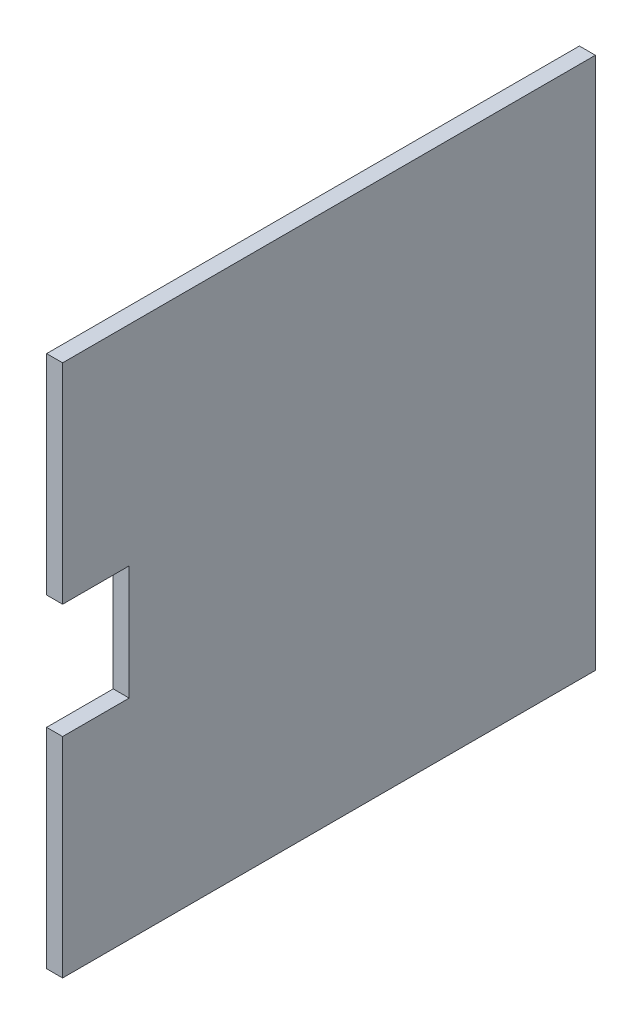
ISO-10303-21;
HEADER;
FILE_DESCRIPTION(('STEP AP214'),'2;1');
FILE_NAME('part.step','',(''),(''),'','','');
FILE_SCHEMA(('AUTOMOTIVE_DESIGN { 1 0 10303 214 1 1 1 1 }'));
ENDSEC;
DATA;
#1=APPLICATION_CONTEXT('core data for automotive mechanical design processes');
#2=APPLICATION_PROTOCOL_DEFINITION('international standard','automotive_design',2000,#1);
#3=PRODUCT_CONTEXT('',#1,'mechanical');
#4=PRODUCT('Part','Part','',(#3));
#5=PRODUCT_RELATED_PRODUCT_CATEGORY('part','',(#4));
#6=PRODUCT_DEFINITION_FORMATION('','',#4);
#7=PRODUCT_DEFINITION_CONTEXT('part definition',#1,'design');
#8=PRODUCT_DEFINITION('design','',#6,#7);
#9=PRODUCT_DEFINITION_SHAPE('','',#8);
#10=(LENGTH_UNIT() NAMED_UNIT(*) SI_UNIT(.MILLI.,.METRE.));
#11=(NAMED_UNIT(*) PLANE_ANGLE_UNIT() SI_UNIT($,.RADIAN.));
#12=(NAMED_UNIT(*) SI_UNIT($,.STERADIAN.) SOLID_ANGLE_UNIT());
#13=UNCERTAINTY_MEASURE_WITH_UNIT(LENGTH_MEASURE(1.E-05),#10,'distance_accuracy_value','');
#14=(GEOMETRIC_REPRESENTATION_CONTEXT(3) GLOBAL_UNCERTAINTY_ASSIGNED_CONTEXT((#13)) GLOBAL_UNIT_ASSIGNED_CONTEXT((#10,
#11,#12)) REPRESENTATION_CONTEXT('',''));
#15=CARTESIAN_POINT('',(0.,0.,0.));
#16=DIRECTION('',(0.,0.,1.));
#17=DIRECTION('',(1.,0.,0.));
#18=AXIS2_PLACEMENT_3D('',#15,#16,#17);
#19=CARTESIAN_POINT('',(6.,83.9093072496867,81.030303030303));
#20=DIRECTION('',(0.,0.,-1.));
#21=DIRECTION('',(-1.,0.,0.));
#22=AXIS2_PLACEMENT_3D('',#19,#20,#21);
#23=PLANE('',#22);
#24=DIRECTION('',(0.,-1.,0.));
#25=VECTOR('',#24,1.);
#26=CARTESIAN_POINT('',(0.,83.9093072496867,81.030303030303));
#27=LINE('',#26,#25);
#28=CARTESIAN_POINT('',(0.,83.9093072496867,81.030303030303));
#29=VERTEX_POINT('',#28);
#30=CARTESIAN_POINT('',(0.,5.40930724968666,81.030303030303));
#31=VERTEX_POINT('',#30);
#32=EDGE_CURVE('E140',#29,#31,#27,.T.);
#33=ORIENTED_EDGE('',*,*,#32,.T.);
#34=DIRECTION('',(-1.,0.,0.));
#35=VECTOR('',#34,1.);
#36=CARTESIAN_POINT('',(6.,5.40930724968666,81.030303030303));
#37=LINE('',#36,#35);
#38=CARTESIAN_POINT('',(6.,5.40930724968666,81.030303030303));
#39=VERTEX_POINT('',#38);
#40=EDGE_CURVE('E11',#39,#31,#37,.T.);
#41=ORIENTED_EDGE('',*,*,#40,.F.);
#42=DIRECTION('',(0.,-1.,0.));
#43=VECTOR('',#42,1.);
#44=CARTESIAN_POINT('',(6.,83.9093072496867,81.030303030303));
#45=LINE('',#44,#43);
#46=CARTESIAN_POINT('',(6.,83.9093072496867,81.030303030303));
#47=VERTEX_POINT('',#46);
#48=EDGE_CURVE('E163',#47,#39,#45,.T.);
#49=ORIENTED_EDGE('',*,*,#48,.F.);
#50=DIRECTION('',(-1.,0.,0.));
#51=VECTOR('',#50,1.);
#52=CARTESIAN_POINT('',(6.,83.9093072496867,81.030303030303));
#53=LINE('',#52,#51);
#54=EDGE_CURVE('E136',#47,#29,#53,.T.);
#55=ORIENTED_EDGE('',*,*,#54,.T.);
#56=EDGE_LOOP('',(#33,#41,#49,#55));
#57=FACE_BOUND('',#56,.T.);
#58=ADVANCED_FACE('F39',(#57),#23,.F.);
#59=CARTESIAN_POINT('',(6.,5.40930724968666,81.030303030303));
#60=DIRECTION('',(0.,1.,0.));
#61=DIRECTION('',(0.,0.,1.));
#62=AXIS2_PLACEMENT_3D('',#59,#60,#61);
#63=PLANE('',#62);
#64=DIRECTION('',(0.,0.,-1.));
#65=VECTOR('',#64,1.);
#66=CARTESIAN_POINT('',(0.,5.40930724968666,81.030303030303));
#67=LINE('',#66,#65);
#68=CARTESIAN_POINT('',(0.,5.40930724968666,56.030303030303));
#69=VERTEX_POINT('',#68);
#70=EDGE_CURVE('E144',#31,#69,#67,.T.);
#71=ORIENTED_EDGE('',*,*,#70,.T.);
#72=DIRECTION('',(-1.,0.,0.));
#73=VECTOR('',#72,1.);
#74=CARTESIAN_POINT('',(6.,5.40930724968666,56.030303030303));
#75=LINE('',#74,#73);
#76=CARTESIAN_POINT('',(6.,5.40930724968666,56.030303030303));
#77=VERTEX_POINT('',#76);
#78=EDGE_CURVE('E48',#77,#69,#75,.T.);
#79=ORIENTED_EDGE('',*,*,#78,.F.);
#80=DIRECTION('',(0.,0.,-1.));
#81=VECTOR('',#80,1.);
#82=CARTESIAN_POINT('',(6.,5.40930724968666,81.030303030303));
#83=LINE('',#82,#81);
#84=EDGE_CURVE('E99',#39,#77,#83,.T.);
#85=ORIENTED_EDGE('',*,*,#84,.F.);
#86=ORIENTED_EDGE('',*,*,#40,.T.);
#87=EDGE_LOOP('',(#71,#79,#85,#86));
#88=FACE_BOUND('',#87,.T.);
#89=ADVANCED_FACE('F184',(#88),#63,.F.);
#90=CARTESIAN_POINT('',(6.,-16.0906927503133,56.030303030303));
#91=DIRECTION('',(0.,0.,-1.));
#92=DIRECTION('',(-1.,0.,0.));
#93=AXIS2_PLACEMENT_3D('',#90,#91,#92);
#94=PLANE('',#93);
#95=DIRECTION('',(0.,-1.,0.));
#96=VECTOR('',#95,1.);
#97=CARTESIAN_POINT('',(0.,-16.0906927503133,56.030303030303));
#98=LINE('',#97,#96);
#99=CARTESIAN_POINT('',(0.,-37.5906927503133,56.030303030303));
#100=VERTEX_POINT('',#99);
#101=EDGE_CURVE('E148',#69,#100,#98,.T.);
#102=ORIENTED_EDGE('',*,*,#101,.T.);
#103=DIRECTION('',(-1.,0.,0.));
#104=VECTOR('',#103,1.);
#105=CARTESIAN_POINT('',(6.,-37.5906927503133,56.030303030303));
#106=LINE('',#105,#104);
#107=CARTESIAN_POINT('',(6.,-37.5906927503133,56.030303030303));
#108=VERTEX_POINT('',#107);
#109=EDGE_CURVE('E174',#108,#100,#106,.T.);
#110=ORIENTED_EDGE('',*,*,#109,.F.);
#111=DIRECTION('',(0.,-1.,0.));
#112=VECTOR('',#111,1.);
#113=CARTESIAN_POINT('',(6.,-16.0906927503133,56.030303030303));
#114=LINE('',#113,#112);
#115=EDGE_CURVE('E183',#77,#108,#114,.T.);
#116=ORIENTED_EDGE('',*,*,#115,.F.);
#117=ORIENTED_EDGE('',*,*,#78,.T.);
#118=EDGE_LOOP('',(#102,#110,#116,#117));
#119=FACE_BOUND('',#118,.T.);
#120=ADVANCED_FACE('F181',(#119),#94,.F.);
#121=CARTESIAN_POINT('',(6.,-37.5906927503133,81.030303030303));
#122=DIRECTION('',(0.,-1.,0.));
#123=DIRECTION('',(0.,0.,-1.));
#124=AXIS2_PLACEMENT_3D('',#121,#122,#123);
#125=PLANE('',#124);
#126=DIRECTION('',(0.,0.,1.));
#127=VECTOR('',#126,1.);
#128=CARTESIAN_POINT('',(0.,-37.5906927503133,81.030303030303));
#129=LINE('',#128,#127);
#130=CARTESIAN_POINT('',(0.,-37.5906927503133,81.030303030303));
#131=VERTEX_POINT('',#130);
#132=EDGE_CURVE('E151',#100,#131,#129,.T.);
#133=ORIENTED_EDGE('',*,*,#132,.T.);
#134=DIRECTION('',(-1.,0.,0.));
#135=VECTOR('',#134,1.);
#136=CARTESIAN_POINT('',(6.,-37.5906927503133,81.030303030303));
#137=LINE('',#136,#135);
#138=CARTESIAN_POINT('',(6.,-37.5906927503133,81.030303030303));
#139=VERTEX_POINT('',#138);
#140=EDGE_CURVE('E170',#139,#131,#137,.T.);
#141=ORIENTED_EDGE('',*,*,#140,.F.);
#142=DIRECTION('',(0.,0.,1.));
#143=VECTOR('',#142,1.);
#144=CARTESIAN_POINT('',(6.,-37.5906927503133,81.030303030303));
#145=LINE('',#144,#143);
#146=EDGE_CURVE('E198',#108,#139,#145,.T.);
#147=ORIENTED_EDGE('',*,*,#146,.F.);
#148=ORIENTED_EDGE('',*,*,#109,.T.);
#149=EDGE_LOOP('',(#133,#141,#147,#148));
#150=FACE_BOUND('',#149,.T.);
#151=ADVANCED_FACE('F193',(#150),#125,.F.);
#152=CARTESIAN_POINT('',(6.,-37.5906927503133,81.030303030303));
#153=DIRECTION('',(0.,0.,-1.));
#154=DIRECTION('',(-1.,0.,0.));
#155=AXIS2_PLACEMENT_3D('',#152,#153,#154);
#156=PLANE('',#155);
#157=DIRECTION('',(0.,-1.,0.));
#158=VECTOR('',#157,1.);
#159=CARTESIAN_POINT('',(0.,-37.5906927503133,81.030303030303));
#160=LINE('',#159,#158);
#161=CARTESIAN_POINT('',(0.,-116.090692750313,81.030303030303));
#162=VERTEX_POINT('',#161);
#163=EDGE_CURVE('E154',#131,#162,#160,.T.);
#164=ORIENTED_EDGE('',*,*,#163,.T.);
#165=DIRECTION('',(-1.,0.,0.));
#166=VECTOR('',#165,1.);
#167=CARTESIAN_POINT('',(6.,-116.090692750313,81.030303030303));
#168=LINE('',#167,#166);
#169=CARTESIAN_POINT('',(6.,-116.090692750313,81.030303030303));
#170=VERTEX_POINT('',#169);
#171=EDGE_CURVE('E129',#170,#162,#168,.T.);
#172=ORIENTED_EDGE('',*,*,#171,.F.);
#173=DIRECTION('',(0.,-1.,0.));
#174=VECTOR('',#173,1.);
#175=CARTESIAN_POINT('',(6.,-37.5906927503133,81.030303030303));
#176=LINE('',#175,#174);
#177=EDGE_CURVE('E118',#139,#170,#176,.T.);
#178=ORIENTED_EDGE('',*,*,#177,.F.);
#179=ORIENTED_EDGE('',*,*,#140,.T.);
#180=EDGE_LOOP('',(#164,#172,#178,#179));
#181=FACE_BOUND('',#180,.T.);
#182=ADVANCED_FACE('F196',(#181),#156,.F.);
#183=CARTESIAN_POINT('',(6.,-116.090692750313,81.030303030303));
#184=DIRECTION('',(0.,1.,0.));
#185=DIRECTION('',(0.,0.,1.));
#186=AXIS2_PLACEMENT_3D('',#183,#184,#185);
#187=PLANE('',#186);
#188=DIRECTION('',(0.,0.,-1.));
#189=VECTOR('',#188,1.);
#190=CARTESIAN_POINT('',(0.,-116.090692750313,81.030303030303));
#191=LINE('',#190,#189);
#192=CARTESIAN_POINT('',(0.,-116.090692750313,-118.969696969697));
#193=VERTEX_POINT('',#192);
#194=EDGE_CURVE('E127',#162,#193,#191,.T.);
#195=ORIENTED_EDGE('',*,*,#194,.T.);
#196=DIRECTION('',(-1.,0.,0.));
#197=VECTOR('',#196,1.);
#198=CARTESIAN_POINT('',(6.,-116.090692750313,-118.969696969697));
#199=LINE('',#198,#197);
#200=CARTESIAN_POINT('',(6.,-116.090692750313,-118.969696969697));
#201=VERTEX_POINT('',#200);
#202=EDGE_CURVE('E124',#201,#193,#199,.T.);
#203=ORIENTED_EDGE('',*,*,#202,.F.);
#204=DIRECTION('',(0.,0.,-1.));
#205=VECTOR('',#204,1.);
#206=CARTESIAN_POINT('',(6.,-116.090692750313,81.030303030303));
#207=LINE('',#206,#205);
#208=EDGE_CURVE('E112',#170,#201,#207,.T.);
#209=ORIENTED_EDGE('',*,*,#208,.F.);
#210=ORIENTED_EDGE('',*,*,#171,.T.);
#211=EDGE_LOOP('',(#195,#203,#209,#210));
#212=FACE_BOUND('',#211,.T.);
#213=ADVANCED_FACE('F125',(#212),#187,.F.);
#214=CARTESIAN_POINT('',(6.,83.9093072496867,-118.969696969697));
#215=DIRECTION('',(0.,0.,1.));
#216=DIRECTION('',(0.,-1.,0.));
#217=AXIS2_PLACEMENT_3D('',#214,#215,#216);
#218=PLANE('',#217);
#219=DIRECTION('',(0.,1.,0.));
#220=VECTOR('',#219,1.);
#221=CARTESIAN_POINT('',(0.,83.9093072496867,-118.969696969697));
#222=LINE('',#221,#220);
#223=CARTESIAN_POINT('',(0.,83.9093072496867,-118.969696969697));
#224=VERTEX_POINT('',#223);
#225=EDGE_CURVE('E85',#193,#224,#222,.T.);
#226=ORIENTED_EDGE('',*,*,#225,.T.);
#227=DIRECTION('',(-1.,0.,0.));
#228=VECTOR('',#227,1.);
#229=CARTESIAN_POINT('',(6.,83.9093072496867,-118.969696969697));
#230=LINE('',#229,#228);
#231=CARTESIAN_POINT('',(6.,83.9093072496867,-118.969696969697));
#232=VERTEX_POINT('',#231);
#233=EDGE_CURVE('E130',#232,#224,#230,.T.);
#234=ORIENTED_EDGE('',*,*,#233,.F.);
#235=DIRECTION('',(0.,1.,0.));
#236=VECTOR('',#235,1.);
#237=CARTESIAN_POINT('',(6.,83.9093072496867,-118.969696969697));
#238=LINE('',#237,#236);
#239=EDGE_CURVE('E116',#201,#232,#238,.T.);
#240=ORIENTED_EDGE('',*,*,#239,.F.);
#241=ORIENTED_EDGE('',*,*,#202,.T.);
#242=EDGE_LOOP('',(#226,#234,#240,#241));
#243=FACE_BOUND('',#242,.T.);
#244=ADVANCED_FACE('F132',(#243),#218,.F.);
#245=CARTESIAN_POINT('',(6.,83.9093072496867,81.030303030303));
#246=DIRECTION('',(0.,-1.,0.));
#247=DIRECTION('',(0.,0.,-1.));
#248=AXIS2_PLACEMENT_3D('',#245,#246,#247);
#249=PLANE('',#248);
#250=DIRECTION('',(0.,0.,1.));
#251=VECTOR('',#250,1.);
#252=CARTESIAN_POINT('',(0.,83.9093072496867,81.030303030303));
#253=LINE('',#252,#251);
#254=EDGE_CURVE('E91',#224,#29,#253,.T.);
#255=ORIENTED_EDGE('',*,*,#254,.T.);
#256=ORIENTED_EDGE('',*,*,#54,.F.);
#257=DIRECTION('',(0.,0.,1.));
#258=VECTOR('',#257,1.);
#259=CARTESIAN_POINT('',(6.,83.9093072496867,81.030303030303));
#260=LINE('',#259,#258);
#261=EDGE_CURVE('E56',#232,#47,#260,.T.);
#262=ORIENTED_EDGE('',*,*,#261,.F.);
#263=ORIENTED_EDGE('',*,*,#233,.T.);
#264=EDGE_LOOP('',(#255,#256,#262,#263));
#265=FACE_BOUND('',#264,.T.);
#266=ADVANCED_FACE('F209',(#265),#249,.F.);
#267=CARTESIAN_POINT('',(6.,0.,0.));
#268=DIRECTION('',(1.,0.,0.));
#269=DIRECTION('',(0.,0.,-1.));
#270=AXIS2_PLACEMENT_3D('',#267,#268,#269);
#271=PLANE('',#270);
#272=ORIENTED_EDGE('',*,*,#48,.T.);
#273=ORIENTED_EDGE('',*,*,#84,.T.);
#274=ORIENTED_EDGE('',*,*,#115,.T.);
#275=ORIENTED_EDGE('',*,*,#146,.T.);
#276=ORIENTED_EDGE('',*,*,#177,.T.);
#277=ORIENTED_EDGE('',*,*,#208,.T.);
#278=ORIENTED_EDGE('',*,*,#239,.T.);
#279=ORIENTED_EDGE('',*,*,#261,.T.);
#280=EDGE_LOOP('',(#272,#273,#274,#275,#276,#277,#278,#279));
#281=FACE_BOUND('',#280,.T.);
#282=ADVANCED_FACE('F114',(#281),#271,.T.);
#283=CARTESIAN_POINT('',(0.,0.,0.));
#284=DIRECTION('',(1.,0.,0.));
#285=DIRECTION('',(0.,0.,-1.));
#286=AXIS2_PLACEMENT_3D('',#283,#284,#285);
#287=PLANE('',#286);
#288=ORIENTED_EDGE('',*,*,#32,.F.);
#289=ORIENTED_EDGE('',*,*,#254,.F.);
#290=ORIENTED_EDGE('',*,*,#225,.F.);
#291=ORIENTED_EDGE('',*,*,#194,.F.);
#292=ORIENTED_EDGE('',*,*,#163,.F.);
#293=ORIENTED_EDGE('',*,*,#132,.F.);
#294=ORIENTED_EDGE('',*,*,#101,.F.);
#295=ORIENTED_EDGE('',*,*,#70,.F.);
#296=EDGE_LOOP('',(#288,#289,#290,#291,#292,#293,#294,#295));
#297=FACE_BOUND('',#296,.T.);
#298=ADVANCED_FACE('F188',(#297),#287,.F.);
#299=CLOSED_SHELL('',(#58,#89,#120,#151,#182,#213,#244,#266,#282,#298));
#300=MANIFOLD_SOLID_BREP('B2',#299);
#301=ADVANCED_BREP_SHAPE_REPRESENTATION('',(#18,#300),#14);
#302=SHAPE_DEFINITION_REPRESENTATION(#9,#301);
ENDSEC;
END-ISO-10303-21;
